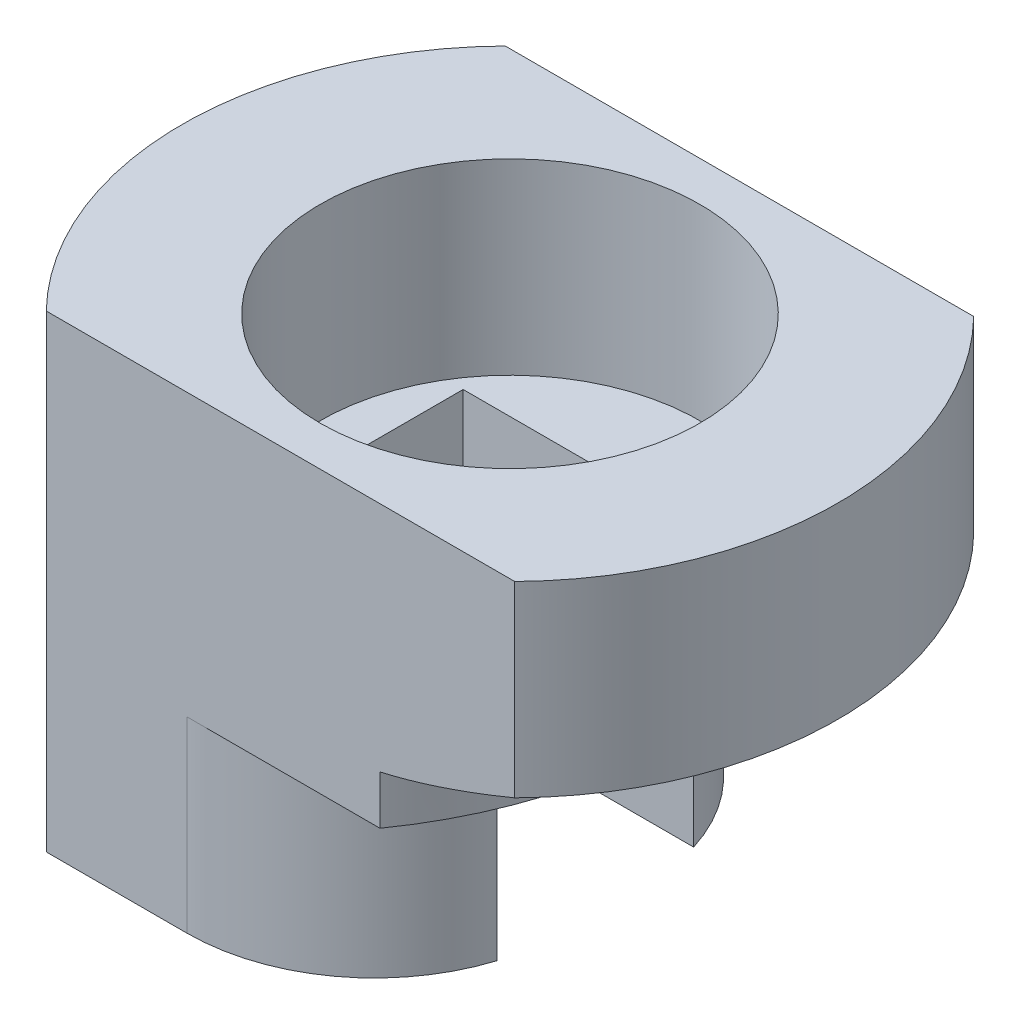
ISO-10303-21;
HEADER;
FILE_DESCRIPTION(('STEP AP214'),'2;1');
FILE_NAME('part.step','',(''),(''),'','','');
FILE_SCHEMA(('AUTOMOTIVE_DESIGN { 1 0 10303 214 1 1 1 1 }'));
ENDSEC;
DATA;
#1=APPLICATION_CONTEXT('core data for automotive mechanical design processes');
#2=APPLICATION_PROTOCOL_DEFINITION('international standard','automotive_design',2000,#1);
#3=PRODUCT_CONTEXT('',#1,'mechanical');
#4=PRODUCT('Part','Part','',(#3));
#5=PRODUCT_RELATED_PRODUCT_CATEGORY('part','',(#4));
#6=PRODUCT_DEFINITION_FORMATION('','',#4);
#7=PRODUCT_DEFINITION_CONTEXT('part definition',#1,'design');
#8=PRODUCT_DEFINITION('design','',#6,#7);
#9=PRODUCT_DEFINITION_SHAPE('','',#8);
#10=(LENGTH_UNIT() NAMED_UNIT(*) SI_UNIT(.MILLI.,.METRE.));
#11=(NAMED_UNIT(*) PLANE_ANGLE_UNIT() SI_UNIT($,.RADIAN.));
#12=(NAMED_UNIT(*) SI_UNIT($,.STERADIAN.) SOLID_ANGLE_UNIT());
#13=UNCERTAINTY_MEASURE_WITH_UNIT(LENGTH_MEASURE(1.E-05),#10,'distance_accuracy_value','');
#14=(GEOMETRIC_REPRESENTATION_CONTEXT(3) GLOBAL_UNCERTAINTY_ASSIGNED_CONTEXT((#13)) GLOBAL_UNIT_ASSIGNED_CONTEXT((#10,
#11,#12)) REPRESENTATION_CONTEXT('',''));
#15=CARTESIAN_POINT('',(0.,0.,0.));
#16=DIRECTION('',(0.,0.,1.));
#17=DIRECTION('',(1.,0.,0.));
#18=AXIS2_PLACEMENT_3D('',#15,#16,#17);
#19=CARTESIAN_POINT('',(3.1,6.,2.1));
#20=DIRECTION('',(1.,0.,0.));
#21=DIRECTION('',(0.,0.,-1.));
#22=AXIS2_PLACEMENT_3D('',#19,#20,#21);
#23=PLANE('',#22);
#24=DIRECTION('',(0.,0.,-1.));
#25=VECTOR('',#24,1.);
#26=CARTESIAN_POINT('',(3.1,4.,2.1));
#27=LINE('',#26,#25);
#28=CARTESIAN_POINT('',(3.1,4.,2.1));
#29=VERTEX_POINT('',#28);
#30=CARTESIAN_POINT('',(3.1,4.,-2.1));
#31=VERTEX_POINT('',#30);
#32=EDGE_CURVE('E267',#29,#31,#27,.T.);
#33=ORIENTED_EDGE('',*,*,#32,.F.);
#34=DIRECTION('',(0.,-1.,0.));
#35=VECTOR('',#34,1.);
#36=CARTESIAN_POINT('',(3.1,6.,2.1));
#37=LINE('',#36,#35);
#38=CARTESIAN_POINT('',(3.1,6.,2.1));
#39=VERTEX_POINT('',#38);
#40=EDGE_CURVE('E191',#39,#29,#37,.T.);
#41=ORIENTED_EDGE('',*,*,#40,.F.);
#42=DIRECTION('',(0.,0.,1.));
#43=VECTOR('',#42,1.);
#44=CARTESIAN_POINT('',(3.1,6.,2.1));
#45=LINE('',#44,#43);
#46=CARTESIAN_POINT('',(3.1,6.,-2.1));
#47=VERTEX_POINT('',#46);
#48=EDGE_CURVE('E175',#47,#39,#45,.T.);
#49=ORIENTED_EDGE('',*,*,#48,.F.);
#50=DIRECTION('',(0.,-1.,0.));
#51=VECTOR('',#50,1.);
#52=CARTESIAN_POINT('',(3.1,6.,-2.1));
#53=LINE('',#52,#51);
#54=EDGE_CURVE('E194',#47,#31,#53,.T.);
#55=ORIENTED_EDGE('',*,*,#54,.T.);
#56=EDGE_LOOP('',(#33,#41,#49,#55));
#57=FACE_BOUND('',#56,.T.);
#58=ADVANCED_FACE('F34',(#57),#23,.F.);
#59=CARTESIAN_POINT('',(-4.82182538049648,4.,0.));
#60=DIRECTION('',(0.,-1.,0.));
#61=DIRECTION('',(0.,0.,-1.));
#62=AXIS2_PLACEMENT_3D('',#59,#60,#61);
#63=CYLINDRICAL_SURFACE('',#62,8.5);
#64=CARTESIAN_POINT('',(-4.82182538049647,4.,0.));
#65=DIRECTION('',(0.,-1.,0.));
#66=DIRECTION('',(0.,0.,-1.));
#67=AXIS2_PLACEMENT_3D('',#64,#65,#66);
#68=CIRCLE('',#67,8.49999999999999);
#69=CARTESIAN_POINT('',(2.12439661422842,4.,-4.89897948556636));
#70=VERTEX_POINT('',#69);
#71=CARTESIAN_POINT('',(2.12439661422843,4.,4.89897948556636));
#72=VERTEX_POINT('',#71);
#73=EDGE_CURVE('E134',#70,#72,#68,.T.);
#74=ORIENTED_EDGE('',*,*,#73,.F.);
#75=DIRECTION('',(0.,-1.,0.));
#76=VECTOR('',#75,1.);
#77=CARTESIAN_POINT('',(2.12439661422843,4.,-4.89897948556636));
#78=LINE('',#77,#76);
#79=CARTESIAN_POINT('',(2.12439661422843,5.04146129287725,-4.89897948556636));
#80=VERTEX_POINT('',#79);
#81=EDGE_CURVE('E142',#70,#80,#78,.F.);
#82=ORIENTED_EDGE('',*,*,#81,.T.);
#83=CARTESIAN_POINT('',(2.12439661422843,5.04146129287725,-4.89897948556636));
#84=CARTESIAN_POINT('',(2.19116690775878,5.00665268381085,-4.80430480549321));
#85=CARTESIAN_POINT('',(2.25606199377697,4.97222762643024,-4.70818228657948));
#86=CARTESIAN_POINT('',(2.38200547121977,4.90429235565408,-4.51312589146357));
#87=CARTESIAN_POINT('',(2.44305361961041,4.87078220013397,-4.41419183821178));
#88=CARTESIAN_POINT('',(2.62036344425815,4.77180060890213,-4.11316000344531));
#89=CARTESIAN_POINT('',(2.73068559659549,4.7079330411442,-3.90698111822491));
#90=CARTESIAN_POINT('',(2.93521894685641,4.58565496123967,-3.4833855289679));
#91=CARTESIAN_POINT('',(3.02931519422096,4.52728461619106,-3.26590180038564));
#92=CARTESIAN_POINT('',(3.1995165934209,4.41848417619523,-2.82214368090374));
#93=CARTESIAN_POINT('',(3.27562962750467,4.36805060571784,-2.59587319216795));
#94=CARTESIAN_POINT('',(3.39739699800461,4.28527124994768,-2.17568363107047));
#95=CARTESIAN_POINT('',(3.44604339599539,4.25130559793296,-1.9829475737454));
#96=CARTESIAN_POINT('',(3.52989057218156,4.19175491951158,-1.59327996821773));
#97=CARTESIAN_POINT('',(3.56509212608759,4.16616940961831,-1.39634866275554));
#98=CARTESIAN_POINT('',(3.62147336226143,4.12473311318383,-1.00027847905929));
#99=CARTESIAN_POINT('',(3.6427088234614,4.10884362048215,-0.801151652205086));
#100=CARTESIAN_POINT('',(3.67105783945396,4.08755072723804,-0.401343385853716));
#101=CARTESIAN_POINT('',(3.67817341399567,4.0821458269519,-0.200662172823817));
#102=CARTESIAN_POINT('',(3.67817561944122,4.08214106193548,0.166444100360481));
#103=CARTESIAN_POINT('',(3.67328173790588,4.08585582945756,0.332875100535753));
#104=CARTESIAN_POINT('',(3.65376541969825,4.10055073671555,0.664828340832154));
#105=CARTESIAN_POINT('',(3.63914395406808,4.11153015126789,0.8303506699974));
#106=CARTESIAN_POINT('',(3.60030003799301,4.14033484977776,1.15990349504454));
#107=CARTESIAN_POINT('',(3.57606349193553,4.15817018324729,1.3239314374056));
#108=CARTESIAN_POINT('',(3.51822297491537,4.20003543764139,1.64952738321747));
#109=CARTESIAN_POINT('',(3.48461814788521,4.22406592466002,1.81109516043635));
#110=CARTESIAN_POINT('',(3.40131324758591,4.28247598204108,2.16053222271677));
#111=CARTESIAN_POINT('',(3.34979111254506,4.31794550319828,2.34778630620285));
#112=CARTESIAN_POINT('',(3.23450760740393,4.39521318517287,2.71715748891691));
#113=CARTESIAN_POINT('',(3.17074429295818,4.43701235114549,2.8992737667964));
#114=CARTESIAN_POINT('',(3.03150410902882,4.52572110318217,3.25763127695213));
#115=CARTESIAN_POINT('',(2.95602962677545,4.57262964715985,3.43387369769374));
#116=CARTESIAN_POINT('',(2.79387627537936,4.67049797543265,3.7798918420383));
#117=CARTESIAN_POINT('',(2.7072006438699,4.72145658744465,3.94966941598377));
#118=CARTESIAN_POINT('',(2.54020931006924,4.81678748991233,4.25140085359159));
#119=CARTESIAN_POINT('',(2.46169794599367,4.86062729228537,4.38452739013696));
#120=CARTESIAN_POINT('',(2.29800729739829,4.94991528816827,4.64560749064864));
#121=CARTESIAN_POINT('',(2.21284340086693,4.99535964402128,4.77357201183929));
#122=CARTESIAN_POINT('',(2.12439661422842,5.04146129287725,4.89897948556636));
#123=B_SPLINE_CURVE_WITH_KNOTS('',3,(#83,#84,#85,#86,#87,#88,#89,#90,#91,#92,#93,#94,#95,#96,
#97,#98,#99,#100,#101,#102,#103,#104,#105,#106,#107,#108,#109,#110,#111,#112,#113,#114,#115,
#116,#117,#118,#119,#120,#121,#122),.UNSPECIFIED.,.F.,.F.,(4,2,2,2,2,2,2,2,2,2,2,2,2,2,2,2,2,2,
2,4),(0.,0.362853801675094,0.725730504050894,1.45205225631793,2.18332515215796,2.91427692561462,
3.51865066076208,4.12298952083184,4.72489982373948,5.32672402146148,5.825921681665,
6.32506951765372,6.82495181957538,7.32487981540154,7.91656243969879,8.50833912263572,
9.09999533459655,9.69148091235183,10.1732098115866,10.6538556644712),.UNSPECIFIED.);
#124=CARTESIAN_POINT('',(2.12439661422843,5.04146129287725,4.89897948556636));
#125=VERTEX_POINT('',#124);
#126=EDGE_CURVE('E239',#80,#125,#123,.T.);
#127=ORIENTED_EDGE('',*,*,#126,.T.);
#128=DIRECTION('',(0.,-1.,0.));
#129=VECTOR('',#128,1.);
#130=CARTESIAN_POINT('',(2.12439661422843,4.,4.89897948556636));
#131=LINE('',#130,#129);
#132=EDGE_CURVE('E144',#125,#72,#131,.T.);
#133=ORIENTED_EDGE('',*,*,#132,.T.);
#134=EDGE_LOOP('',(#74,#82,#127,#133));
#135=FACE_BOUND('',#134,.T.);
#136=ADVANCED_FACE('F140',(#135),#63,.T.);
#137=CARTESIAN_POINT('',(0.,10.,0.));
#138=DIRECTION('',(0.,-1.,0.));
#139=DIRECTION('',(0.,0.,-1.));
#140=AXIS2_PLACEMENT_3D('',#137,#138,#139);
#141=CYLINDRICAL_SURFACE('',#140,7.);
#142=CARTESIAN_POINT('',(0.,10.,0.));
#143=DIRECTION('',(0.,1.,0.));
#144=DIRECTION('',(0.,0.,1.));
#145=AXIS2_PLACEMENT_3D('',#142,#143,#144);
#146=CIRCLE('',#145,7.);
#147=CARTESIAN_POINT('',(-5.,10.,-4.89897948556636));
#148=VERTEX_POINT('',#147);
#149=CARTESIAN_POINT('',(-5.,10.,4.89897948556636));
#150=VERTEX_POINT('',#149);
#151=EDGE_CURVE('E209',#148,#150,#146,.T.);
#152=ORIENTED_EDGE('',*,*,#151,.F.);
#153=DIRECTION('',(0.,1.,0.));
#154=VECTOR('',#153,1.);
#155=CARTESIAN_POINT('',(-5.,0.,-4.89897948556636));
#156=LINE('',#155,#154);
#157=CARTESIAN_POINT('',(-5.,0.,-4.89897948556636));
#158=VERTEX_POINT('',#157);
#159=EDGE_CURVE('E156',#158,#148,#156,.T.);
#160=ORIENTED_EDGE('',*,*,#159,.F.);
#161=CARTESIAN_POINT('',(0.,0.,0.));
#162=DIRECTION('',(0.,1.,0.));
#163=DIRECTION('',(0.,0.,1.));
#164=AXIS2_PLACEMENT_3D('',#161,#162,#163);
#165=CIRCLE('',#164,7.);
#166=CARTESIAN_POINT('',(-5.,0.,4.89897948556636));
#167=VERTEX_POINT('',#166);
#168=EDGE_CURVE('E202',#158,#167,#165,.T.);
#169=ORIENTED_EDGE('',*,*,#168,.T.);
#170=DIRECTION('',(0.,1.,0.));
#171=VECTOR('',#170,1.);
#172=CARTESIAN_POINT('',(-5.,0.,4.89897948556636));
#173=LINE('',#172,#171);
#174=EDGE_CURVE('E162',#167,#150,#173,.T.);
#175=ORIENTED_EDGE('',*,*,#174,.T.);
#176=EDGE_LOOP('',(#152,#160,#169,#175));
#177=FACE_BOUND('',#176,.T.);
#178=ADVANCED_FACE('F235',(#177),#141,.T.);
#179=DIRECTION('',(0.,1.,0.));
#180=VECTOR('',#179,1.);
#181=CARTESIAN_POINT('',(5.,0.,4.89897948556636));
#182=LINE('',#181,#180);
#183=CARTESIAN_POINT('',(5.,6.00000000000002,4.89897948556636));
#184=VERTEX_POINT('',#183);
#185=CARTESIAN_POINT('',(5.,10.,4.89897948556636));
#186=VERTEX_POINT('',#185);
#187=EDGE_CURVE('E160',#184,#186,#182,.T.);
#188=ORIENTED_EDGE('',*,*,#187,.F.);
#189=CARTESIAN_POINT('',(0.,6.00000000000002,0.));
#190=DIRECTION('',(0.,-1.,0.));
#191=DIRECTION('',(0.,0.,-1.));
#192=AXIS2_PLACEMENT_3D('',#189,#190,#191);
#193=CIRCLE('',#192,7.);
#194=CARTESIAN_POINT('',(5.,6.00000000000002,-4.89897948556636));
#195=VERTEX_POINT('',#194);
#196=EDGE_CURVE('E218',#184,#195,#193,.F.);
#197=ORIENTED_EDGE('',*,*,#196,.T.);
#198=DIRECTION('',(0.,1.,0.));
#199=VECTOR('',#198,1.);
#200=CARTESIAN_POINT('',(5.,0.,-4.89897948556636));
#201=LINE('',#200,#199);
#202=CARTESIAN_POINT('',(5.,10.,-4.89897948556636));
#203=VERTEX_POINT('',#202);
#204=EDGE_CURVE('E151',#195,#203,#201,.T.);
#205=ORIENTED_EDGE('',*,*,#204,.T.);
#206=EDGE_CURVE('E205',#186,#203,#146,.T.);
#207=ORIENTED_EDGE('',*,*,#206,.F.);
#208=EDGE_LOOP('',(#188,#197,#205,#207));
#209=FACE_BOUND('',#208,.T.);
#210=ADVANCED_FACE('F294',(#209),#141,.T.);
#211=CARTESIAN_POINT('',(0.,10.,0.));
#212=DIRECTION('',(0.,1.,0.));
#213=DIRECTION('',(0.,0.,1.));
#214=AXIS2_PLACEMENT_3D('',#211,#212,#213);
#215=PLANE('',#214);
#216=DIRECTION('',(1.,0.,0.));
#217=VECTOR('',#216,1.);
#218=CARTESIAN_POINT('',(5.,10.,-4.89897948556636));
#219=LINE('',#218,#217);
#220=EDGE_CURVE('E270',#148,#203,#219,.T.);
#221=ORIENTED_EDGE('',*,*,#220,.F.);
#222=ORIENTED_EDGE('',*,*,#151,.T.);
#223=DIRECTION('',(-1.,0.,0.));
#224=VECTOR('',#223,1.);
#225=CARTESIAN_POINT('',(-5.,10.,4.89897948556636));
#226=LINE('',#225,#224);
#227=EDGE_CURVE('E150',#186,#150,#226,.T.);
#228=ORIENTED_EDGE('',*,*,#227,.F.);
#229=ORIENTED_EDGE('',*,*,#206,.T.);
#230=EDGE_LOOP('',(#221,#222,#228,#229));
#231=FACE_BOUND('',#230,.T.);
#232=CARTESIAN_POINT('',(0.,10.,0.));
#233=DIRECTION('',(0.,1.,0.));
#234=DIRECTION('',(0.,0.,1.));
#235=AXIS2_PLACEMENT_3D('',#232,#233,#234);
#236=CIRCLE('',#235,4.05);
#237=CARTESIAN_POINT('',(0.,10.,4.05));
#238=VERTEX_POINT('',#237);
#239=EDGE_CURVE('E190',#238,#238,#236,.T.);
#240=ORIENTED_EDGE('',*,*,#239,.F.);
#241=EDGE_LOOP('',(#240));
#242=FACE_BOUND('',#241,.T.);
#243=ADVANCED_FACE('F286',(#231,#242),#215,.T.);
#244=CARTESIAN_POINT('',(0.,0.,0.));
#245=DIRECTION('',(0.,1.,0.));
#246=DIRECTION('',(0.,0.,1.));
#247=AXIS2_PLACEMENT_3D('',#244,#245,#246);
#248=PLANE('',#247);
#249=DIRECTION('',(-1.,0.,0.));
#250=VECTOR('',#249,1.);
#251=CARTESIAN_POINT('',(3.1,0.,2.1));
#252=LINE('',#251,#250);
#253=CARTESIAN_POINT('',(1.82084769849489,0.,2.1));
#254=VERTEX_POINT('',#253);
#255=CARTESIAN_POINT('',(-3.1,0.,2.1));
#256=VERTEX_POINT('',#255);
#257=EDGE_CURVE('E172',#254,#256,#252,.T.);
#258=ORIENTED_EDGE('',*,*,#257,.F.);
#259=CARTESIAN_POINT('',(-1.99458802025462,0.,0.898979485566357));
#260=DIRECTION('',(0.,1.,0.));
#261=DIRECTION('',(0.,0.,1.));
#262=AXIS2_PLACEMENT_3D('',#259,#260,#261);
#263=CIRCLE('',#262,4.);
#264=CARTESIAN_POINT('',(-1.99458802025462,0.,4.89897948556636));
#265=VERTEX_POINT('',#264);
#266=EDGE_CURVE('E249',#254,#265,#263,.F.);
#267=ORIENTED_EDGE('',*,*,#266,.T.);
#268=DIRECTION('',(-1.,0.,0.));
#269=VECTOR('',#268,1.);
#270=CARTESIAN_POINT('',(-5.,0.,4.89897948556636));
#271=LINE('',#270,#269);
#272=EDGE_CURVE('E154',#265,#167,#271,.T.);
#273=ORIENTED_EDGE('',*,*,#272,.T.);
#274=ORIENTED_EDGE('',*,*,#168,.F.);
#275=DIRECTION('',(1.,0.,0.));
#276=VECTOR('',#275,1.);
#277=CARTESIAN_POINT('',(5.,0.,-4.89897948556636));
#278=LINE('',#277,#276);
#279=CARTESIAN_POINT('',(-1.99458802025462,0.,-4.89897948556636));
#280=VERTEX_POINT('',#279);
#281=EDGE_CURVE('E273',#158,#280,#278,.T.);
#282=ORIENTED_EDGE('',*,*,#281,.T.);
#283=CARTESIAN_POINT('',(-1.99458802025462,0.,-0.898979485566357));
#284=DIRECTION('',(0.,1.,0.));
#285=DIRECTION('',(0.,0.,1.));
#286=AXIS2_PLACEMENT_3D('',#283,#284,#285);
#287=CIRCLE('',#286,4.);
#288=CARTESIAN_POINT('',(1.82084769849489,0.,-2.1));
#289=VERTEX_POINT('',#288);
#290=EDGE_CURVE('E244',#280,#289,#287,.F.);
#291=ORIENTED_EDGE('',*,*,#290,.T.);
#292=DIRECTION('',(1.,0.,0.));
#293=VECTOR('',#292,1.);
#294=CARTESIAN_POINT('',(3.1,0.,-2.1));
#295=LINE('',#294,#293);
#296=CARTESIAN_POINT('',(-3.1,0.,-2.1));
#297=VERTEX_POINT('',#296);
#298=EDGE_CURVE('E183',#297,#289,#295,.T.);
#299=ORIENTED_EDGE('',*,*,#298,.F.);
#300=DIRECTION('',(0.,0.,-1.));
#301=VECTOR('',#300,1.);
#302=CARTESIAN_POINT('',(-3.1,0.,2.1));
#303=LINE('',#302,#301);
#304=EDGE_CURVE('E167',#256,#297,#303,.T.);
#305=ORIENTED_EDGE('',*,*,#304,.F.);
#306=EDGE_LOOP('',(#258,#267,#273,#274,#282,#291,#299,#305));
#307=FACE_BOUND('',#306,.T.);
#308=ADVANCED_FACE('F316',(#307),#248,.F.);
#309=CARTESIAN_POINT('',(0.,6.,0.));
#310=DIRECTION('',(0.,1.,0.));
#311=DIRECTION('',(0.,0.,1.));
#312=AXIS2_PLACEMENT_3D('',#309,#310,#311);
#313=CYLINDRICAL_SURFACE('',#312,4.05);
#314=CARTESIAN_POINT('',(0.,6.,0.));
#315=DIRECTION('',(0.,1.,0.));
#316=DIRECTION('',(0.,0.,1.));
#317=AXIS2_PLACEMENT_3D('',#314,#315,#316);
#318=CIRCLE('',#317,4.05);
#319=CARTESIAN_POINT('',(0.,6.,4.05));
#320=VERTEX_POINT('',#319);
#321=EDGE_CURVE('E199',#320,#320,#318,.T.);
#322=ORIENTED_EDGE('',*,*,#321,.F.);
#323=EDGE_LOOP('',(#322));
#324=FACE_BOUND('',#323,.T.);
#325=ORIENTED_EDGE('',*,*,#239,.T.);
#326=EDGE_LOOP('',(#325));
#327=FACE_BOUND('',#326,.T.);
#328=ADVANCED_FACE('F334',(#324,#327),#313,.F.);
#329=CARTESIAN_POINT('',(0.,6.,0.));
#330=DIRECTION('',(0.,1.,0.));
#331=DIRECTION('',(0.,0.,1.));
#332=AXIS2_PLACEMENT_3D('',#329,#330,#331);
#333=PLANE('',#332);
#334=DIRECTION('',(0.,0.,-1.));
#335=VECTOR('',#334,1.);
#336=CARTESIAN_POINT('',(-3.1,6.,2.1));
#337=LINE('',#336,#335);
#338=CARTESIAN_POINT('',(-3.1,6.,2.1));
#339=VERTEX_POINT('',#338);
#340=CARTESIAN_POINT('',(-3.1,6.,-2.1));
#341=VERTEX_POINT('',#340);
#342=EDGE_CURVE('E168',#339,#341,#337,.T.);
#343=ORIENTED_EDGE('',*,*,#342,.T.);
#344=DIRECTION('',(1.,0.,0.));
#345=VECTOR('',#344,1.);
#346=CARTESIAN_POINT('',(3.1,6.,-2.1));
#347=LINE('',#346,#345);
#348=EDGE_CURVE('E171',#341,#47,#347,.T.);
#349=ORIENTED_EDGE('',*,*,#348,.T.);
#350=ORIENTED_EDGE('',*,*,#48,.T.);
#351=DIRECTION('',(-1.,0.,0.));
#352=VECTOR('',#351,1.);
#353=CARTESIAN_POINT('',(3.1,6.,2.1));
#354=LINE('',#353,#352);
#355=EDGE_CURVE('E178',#39,#339,#354,.T.);
#356=ORIENTED_EDGE('',*,*,#355,.T.);
#357=EDGE_LOOP('',(#343,#349,#350,#356));
#358=FACE_BOUND('',#357,.T.);
#359=ORIENTED_EDGE('',*,*,#321,.T.);
#360=EDGE_LOOP('',(#359));
#361=FACE_BOUND('',#360,.T.);
#362=ADVANCED_FACE('F310',(#358,#361),#333,.T.);
#363=CARTESIAN_POINT('',(-3.1,6.,2.1));
#364=DIRECTION('',(-1.,0.,0.));
#365=DIRECTION('',(0.,0.,1.));
#366=AXIS2_PLACEMENT_3D('',#363,#364,#365);
#367=PLANE('',#366);
#368=ORIENTED_EDGE('',*,*,#304,.T.);
#369=DIRECTION('',(0.,-1.,0.));
#370=VECTOR('',#369,1.);
#371=CARTESIAN_POINT('',(-3.1,6.,-2.1));
#372=LINE('',#371,#370);
#373=EDGE_CURVE('E181',#341,#297,#372,.T.);
#374=ORIENTED_EDGE('',*,*,#373,.F.);
#375=ORIENTED_EDGE('',*,*,#342,.F.);
#376=DIRECTION('',(0.,-1.,0.));
#377=VECTOR('',#376,1.);
#378=CARTESIAN_POINT('',(-3.1,6.,2.1));
#379=LINE('',#378,#377);
#380=EDGE_CURVE('E187',#339,#256,#379,.T.);
#381=ORIENTED_EDGE('',*,*,#380,.T.);
#382=EDGE_LOOP('',(#368,#374,#375,#381));
#383=FACE_BOUND('',#382,.T.);
#384=ADVANCED_FACE('F329',(#383),#367,.F.);
#385=CARTESIAN_POINT('',(3.1,6.,2.1));
#386=DIRECTION('',(0.,0.,1.));
#387=DIRECTION('',(1.,0.,0.));
#388=AXIS2_PLACEMENT_3D('',#385,#386,#387);
#389=PLANE('',#388);
#390=DIRECTION('',(1.,0.,0.));
#391=VECTOR('',#390,1.);
#392=CARTESIAN_POINT('',(3.1,4.,2.1));
#393=LINE('',#392,#391);
#394=CARTESIAN_POINT('',(1.82084769849489,4.,2.1));
#395=VERTEX_POINT('',#394);
#396=EDGE_CURVE('E256',#395,#29,#393,.T.);
#397=ORIENTED_EDGE('',*,*,#396,.F.);
#398=DIRECTION('',(0.,-1.,0.));
#399=VECTOR('',#398,1.);
#400=CARTESIAN_POINT('',(1.82084769849489,6.,2.1));
#401=LINE('',#400,#399);
#402=EDGE_CURVE('E263',#395,#254,#401,.T.);
#403=ORIENTED_EDGE('',*,*,#402,.T.);
#404=ORIENTED_EDGE('',*,*,#257,.T.);
#405=ORIENTED_EDGE('',*,*,#380,.F.);
#406=ORIENTED_EDGE('',*,*,#355,.F.);
#407=ORIENTED_EDGE('',*,*,#40,.T.);
#408=EDGE_LOOP('',(#397,#403,#404,#405,#406,#407));
#409=FACE_BOUND('',#408,.T.);
#410=ADVANCED_FACE('F236',(#409),#389,.F.);
#411=CARTESIAN_POINT('',(3.1,6.,-2.1));
#412=DIRECTION('',(0.,0.,-1.));
#413=DIRECTION('',(-1.,0.,0.));
#414=AXIS2_PLACEMENT_3D('',#411,#412,#413);
#415=PLANE('',#414);
#416=ORIENTED_EDGE('',*,*,#298,.T.);
#417=DIRECTION('',(0.,1.,0.));
#418=VECTOR('',#417,1.);
#419=CARTESIAN_POINT('',(1.82084769849489,6.,-2.1));
#420=LINE('',#419,#418);
#421=CARTESIAN_POINT('',(1.82084769849489,4.,-2.1));
#422=VERTEX_POINT('',#421);
#423=EDGE_CURVE('E266',#289,#422,#420,.T.);
#424=ORIENTED_EDGE('',*,*,#423,.T.);
#425=DIRECTION('',(-1.,0.,0.));
#426=VECTOR('',#425,1.);
#427=CARTESIAN_POINT('',(3.1,4.,-2.1));
#428=LINE('',#427,#426);
#429=EDGE_CURVE('E299',#31,#422,#428,.T.);
#430=ORIENTED_EDGE('',*,*,#429,.F.);
#431=ORIENTED_EDGE('',*,*,#54,.F.);
#432=ORIENTED_EDGE('',*,*,#348,.F.);
#433=ORIENTED_EDGE('',*,*,#373,.T.);
#434=EDGE_LOOP('',(#416,#424,#430,#431,#432,#433));
#435=FACE_BOUND('',#434,.T.);
#436=ADVANCED_FACE('F228',(#435),#415,.F.);
#437=CARTESIAN_POINT('',(-5.,0.,4.89897948556636));
#438=DIRECTION('',(0.,0.,-1.));
#439=DIRECTION('',(-1.,0.,0.));
#440=AXIS2_PLACEMENT_3D('',#437,#438,#439);
#441=PLANE('',#440);
#442=ORIENTED_EDGE('',*,*,#272,.F.);
#443=DIRECTION('',(0.,1.,0.));
#444=VECTOR('',#443,1.);
#445=CARTESIAN_POINT('',(-1.99458802025462,0.,4.89897948556636));
#446=LINE('',#445,#444);
#447=CARTESIAN_POINT('',(-1.99458802025462,4.,4.89897948556634));
#448=VERTEX_POINT('',#447);
#449=EDGE_CURVE('E251',#265,#448,#446,.T.);
#450=ORIENTED_EDGE('',*,*,#449,.T.);
#451=DIRECTION('',(-1.,0.,0.));
#452=VECTOR('',#451,1.);
#453=CARTESIAN_POINT('',(1.82084769849489,4.,4.89897948556636));
#454=LINE('',#453,#452);
#455=EDGE_CURVE('E56',#72,#448,#454,.T.);
#456=ORIENTED_EDGE('',*,*,#455,.F.);
#457=ORIENTED_EDGE('',*,*,#132,.F.);
#458=CARTESIAN_POINT('',(2.12439661422843,5.04146129287725,4.89897948556636));
#459=CARTESIAN_POINT('',(2.24780018934755,5.06980835417495,4.89897948556636));
#460=CARTESIAN_POINT('',(2.37073523730937,5.10012279406216,4.89897948556636));
#461=CARTESIAN_POINT('',(2.61566205643253,5.16426046854448,4.89897948556636));
#462=CARTESIAN_POINT('',(2.73765401338998,5.1980829920604,4.89897948556636));
#463=CARTESIAN_POINT('',(3.10187445680943,5.30407436002154,4.89897948556636));
#464=CARTESIAN_POINT('',(3.34275957206373,5.38086450617103,4.89897948556636));
#465=CARTESIAN_POINT('',(3.82109689771404,5.54386659748727,4.89897948556636));
#466=CARTESIAN_POINT('',(4.05855124840914,5.63007235342051,4.89897948556636));
#467=CARTESIAN_POINT('',(4.41283687931734,5.76491365584586,4.89897948556636));
#468=CARTESIAN_POINT('',(4.53071634307053,5.81082460452166,4.89897948556636));
#469=CARTESIAN_POINT('',(4.76582703123428,5.90425680907593,4.89897948556636));
#470=CARTESIAN_POINT('',(4.88305829728099,5.95177796009395,4.89897948556636));
#471=CARTESIAN_POINT('',(5.,6.00000000000002,4.89897948556636));
#472=B_SPLINE_CURVE_WITH_KNOTS('',3,(#458,#459,#460,#461,#462,#463,#464,#465,#466,#467,#468,
#469,#470,#471),.UNSPECIFIED.,.F.,.F.,(4,2,2,2,2,2,4),(0.,0.379811348320788,0.759545859794433,
1.51774625787417,2.27545122823449,2.6549549276748,3.03443396019537),.UNSPECIFIED.);
#473=EDGE_CURVE('E208',#125,#184,#472,.T.);
#474=ORIENTED_EDGE('',*,*,#473,.T.);
#475=ORIENTED_EDGE('',*,*,#187,.T.);
#476=ORIENTED_EDGE('',*,*,#227,.T.);
#477=ORIENTED_EDGE('',*,*,#174,.F.);
#478=EDGE_LOOP('',(#442,#450,#456,#457,#474,#475,#476,#477));
#479=FACE_BOUND('',#478,.T.);
#480=ADVANCED_FACE('F223',(#479),#441,.F.);
#481=CARTESIAN_POINT('',(5.,0.,-4.89897948556636));
#482=DIRECTION('',(0.,0.,1.));
#483=DIRECTION('',(1.,0.,0.));
#484=AXIS2_PLACEMENT_3D('',#481,#482,#483);
#485=PLANE('',#484);
#486=DIRECTION('',(1.,0.,0.));
#487=VECTOR('',#486,1.);
#488=CARTESIAN_POINT('',(1.82084769849489,4.,-4.89897948556636));
#489=LINE('',#488,#487);
#490=CARTESIAN_POINT('',(-1.99458802025462,4.,-4.89897948556636));
#491=VERTEX_POINT('',#490);
#492=EDGE_CURVE('E49',#491,#70,#489,.T.);
#493=ORIENTED_EDGE('',*,*,#492,.F.);
#494=DIRECTION('',(0.,-1.,0.));
#495=VECTOR('',#494,1.);
#496=CARTESIAN_POINT('',(-1.99458802025462,0.,-4.89897948556636));
#497=LINE('',#496,#495);
#498=EDGE_CURVE('E253',#491,#280,#497,.T.);
#499=ORIENTED_EDGE('',*,*,#498,.T.);
#500=ORIENTED_EDGE('',*,*,#281,.F.);
#501=ORIENTED_EDGE('',*,*,#159,.T.);
#502=ORIENTED_EDGE('',*,*,#220,.T.);
#503=ORIENTED_EDGE('',*,*,#204,.F.);
#504=CARTESIAN_POINT('',(5.,6.00000000000002,-4.89897948556636));
#505=CARTESIAN_POINT('',(4.88305829728099,5.95177796009395,-4.89897948556636));
#506=CARTESIAN_POINT('',(4.76582703123428,5.90425680907593,-4.89897948556636));
#507=CARTESIAN_POINT('',(4.53071634307053,5.81082460452166,-4.89897948556636));
#508=CARTESIAN_POINT('',(4.41283687931734,5.76491365584586,-4.89897948556636));
#509=CARTESIAN_POINT('',(4.05855124840914,5.63007235342051,-4.89897948556636));
#510=CARTESIAN_POINT('',(3.82109689771404,5.54386659748727,-4.89897948556636));
#511=CARTESIAN_POINT('',(3.34275957206373,5.38086450617103,-4.89897948556636));
#512=CARTESIAN_POINT('',(3.10187445680943,5.30407436002154,-4.89897948556636));
#513=CARTESIAN_POINT('',(2.73765401338998,5.1980829920604,-4.89897948556636));
#514=CARTESIAN_POINT('',(2.61566205643253,5.16426046854448,-4.89897948556636));
#515=CARTESIAN_POINT('',(2.37073523730937,5.10012279406216,-4.89897948556636));
#516=CARTESIAN_POINT('',(2.24780018934755,5.06980835417495,-4.89897948556636));
#517=CARTESIAN_POINT('',(2.12439661422843,5.04146129287725,-4.89897948556636));
#518=B_SPLINE_CURVE_WITH_KNOTS('',3,(#504,#505,#506,#507,#508,#509,#510,#511,#512,#513,#514,
#515,#516,#517),.UNSPECIFIED.,.F.,.F.,(4,2,2,2,2,2,4),(0.,0.379479032520569,0.758982731960887,
1.5166877023212,2.27488810040094,2.65462261187458,3.03443396019537),.UNSPECIFIED.);
#519=EDGE_CURVE('E148',#195,#80,#518,.T.);
#520=ORIENTED_EDGE('',*,*,#519,.T.);
#521=ORIENTED_EDGE('',*,*,#81,.F.);
#522=EDGE_LOOP('',(#493,#499,#500,#501,#502,#503,#520,#521));
#523=FACE_BOUND('',#522,.T.);
#524=ADVANCED_FACE('F146',(#523),#485,.F.);
#525=CARTESIAN_POINT('',(0.,4.,0.));
#526=DIRECTION('',(0.,1.,0.));
#527=DIRECTION('',(0.,0.,1.));
#528=AXIS2_PLACEMENT_3D('',#525,#526,#527);
#529=CONICAL_SURFACE('',#528,3.53589838486217,1.0471975511966);
#530=ORIENTED_EDGE('',*,*,#519,.F.);
#531=ORIENTED_EDGE('',*,*,#196,.F.);
#532=ORIENTED_EDGE('',*,*,#473,.F.);
#533=ORIENTED_EDGE('',*,*,#126,.F.);
#534=EDGE_LOOP('',(#530,#531,#532,#533));
#535=FACE_BOUND('',#534,.T.);
#536=ADVANCED_FACE('F220',(#535),#529,.T.);
#537=CARTESIAN_POINT('',(-4.82182538049647,4.,0.));
#538=DIRECTION('',(0.,-1.,0.));
#539=DIRECTION('',(0.,0.,-1.));
#540=AXIS2_PLACEMENT_3D('',#537,#538,#539);
#541=PLANE('',#540);
#542=ORIENTED_EDGE('',*,*,#396,.T.);
#543=ORIENTED_EDGE('',*,*,#32,.T.);
#544=ORIENTED_EDGE('',*,*,#429,.T.);
#545=CARTESIAN_POINT('',(-1.99458802025462,4.,-0.898979485566357));
#546=DIRECTION('',(0.,-1.,0.));
#547=DIRECTION('',(0.,0.,-1.));
#548=AXIS2_PLACEMENT_3D('',#545,#546,#547);
#549=CIRCLE('',#548,4.);
#550=EDGE_CURVE('E11',#422,#491,#549,.F.);
#551=ORIENTED_EDGE('',*,*,#550,.T.);
#552=ORIENTED_EDGE('',*,*,#492,.T.);
#553=ORIENTED_EDGE('',*,*,#73,.T.);
#554=ORIENTED_EDGE('',*,*,#455,.T.);
#555=CARTESIAN_POINT('',(-1.99458802025462,4.,0.898979485566357));
#556=DIRECTION('',(0.,-1.,0.));
#557=DIRECTION('',(0.,0.,-1.));
#558=AXIS2_PLACEMENT_3D('',#555,#556,#557);
#559=CIRCLE('',#558,4.);
#560=EDGE_CURVE('E42',#448,#395,#559,.F.);
#561=ORIENTED_EDGE('',*,*,#560,.T.);
#562=EDGE_LOOP('',(#542,#543,#544,#551,#552,#553,#554,#561));
#563=FACE_BOUND('',#562,.T.);
#564=ADVANCED_FACE('F133',(#563),#541,.T.);
#565=CARTESIAN_POINT('',(-1.99458802025462,4.,0.898979485566357));
#566=DIRECTION('',(0.,1.,0.));
#567=DIRECTION('',(0.,0.,1.));
#568=AXIS2_PLACEMENT_3D('',#565,#566,#567);
#569=CYLINDRICAL_SURFACE('',#568,4.);
#570=ORIENTED_EDGE('',*,*,#560,.F.);
#571=ORIENTED_EDGE('',*,*,#449,.F.);
#572=ORIENTED_EDGE('',*,*,#266,.F.);
#573=ORIENTED_EDGE('',*,*,#402,.F.);
#574=EDGE_LOOP('',(#570,#571,#572,#573));
#575=FACE_BOUND('',#574,.T.);
#576=ADVANCED_FACE('F269',(#575),#569,.T.);
#577=CARTESIAN_POINT('',(-1.99458802025462,4.,-0.898979485566357));
#578=DIRECTION('',(0.,-1.,0.));
#579=DIRECTION('',(0.,0.,-1.));
#580=AXIS2_PLACEMENT_3D('',#577,#578,#579);
#581=CYLINDRICAL_SURFACE('',#580,4.);
#582=ORIENTED_EDGE('',*,*,#550,.F.);
#583=ORIENTED_EDGE('',*,*,#423,.F.);
#584=ORIENTED_EDGE('',*,*,#290,.F.);
#585=ORIENTED_EDGE('',*,*,#498,.F.);
#586=EDGE_LOOP('',(#582,#583,#584,#585));
#587=FACE_BOUND('',#586,.T.);
#588=ADVANCED_FACE('F36',(#587),#581,.T.);
#589=CLOSED_SHELL('',(#58,#136,#178,#210,#243,#308,#328,#362,#384,#410,#436,#480,#524,#536,#564,
#576,#588));
#590=MANIFOLD_SOLID_BREP('B2',#589);
#591=ADVANCED_BREP_SHAPE_REPRESENTATION('',(#18,#590),#14);
#592=SHAPE_DEFINITION_REPRESENTATION(#9,#591);
ENDSEC;
END-ISO-10303-21;
